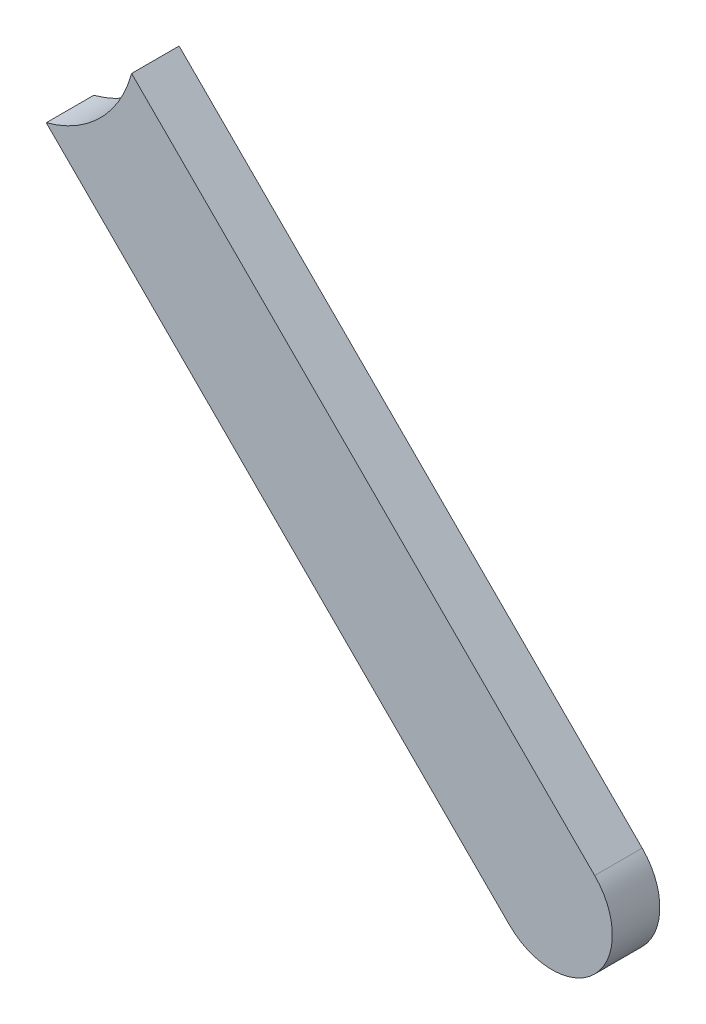
ISO-10303-21;
HEADER;
FILE_DESCRIPTION(('STEP AP214'),'2;1');
FILE_NAME('part.step','',(''),(''),'','','');
FILE_SCHEMA(('AUTOMOTIVE_DESIGN { 1 0 10303 214 1 1 1 1 }'));
ENDSEC;
DATA;
#1=APPLICATION_CONTEXT('core data for automotive mechanical design processes');
#2=APPLICATION_PROTOCOL_DEFINITION('international standard','automotive_design',2000,#1);
#3=PRODUCT_CONTEXT('',#1,'mechanical');
#4=PRODUCT('Part','Part','',(#3));
#5=PRODUCT_RELATED_PRODUCT_CATEGORY('part','',(#4));
#6=PRODUCT_DEFINITION_FORMATION('','',#4);
#7=PRODUCT_DEFINITION_CONTEXT('part definition',#1,'design');
#8=PRODUCT_DEFINITION('design','',#6,#7);
#9=PRODUCT_DEFINITION_SHAPE('','',#8);
#10=(LENGTH_UNIT() NAMED_UNIT(*) SI_UNIT(.MILLI.,.METRE.));
#11=(NAMED_UNIT(*) PLANE_ANGLE_UNIT() SI_UNIT($,.RADIAN.));
#12=(NAMED_UNIT(*) SI_UNIT($,.STERADIAN.) SOLID_ANGLE_UNIT());
#13=UNCERTAINTY_MEASURE_WITH_UNIT(LENGTH_MEASURE(1.E-05),#10,'distance_accuracy_value','');
#14=(GEOMETRIC_REPRESENTATION_CONTEXT(3) GLOBAL_UNCERTAINTY_ASSIGNED_CONTEXT((#13)) GLOBAL_UNIT_ASSIGNED_CONTEXT((#10,
#11,#12)) REPRESENTATION_CONTEXT('',''));
#15=CARTESIAN_POINT('',(0.,0.,0.));
#16=DIRECTION('',(0.,0.,1.));
#17=DIRECTION('',(1.,0.,0.));
#18=AXIS2_PLACEMENT_3D('',#15,#16,#17);
#19=CARTESIAN_POINT('',(90.3014787853028,80.0273093346972,0.));
#20=DIRECTION('',(0.707106781186548,0.707106781186548,0.));
#21=DIRECTION('',(0.707106781186548,-0.707106781186548,0.));
#22=AXIS2_PLACEMENT_3D('',#19,#20,#21);
#23=PLANE('',#22);
#24=DIRECTION('',(0.707106781186548,-0.707106781186548,0.));
#25=VECTOR('',#24,1.);
#26=CARTESIAN_POINT('',(89.99039406,80.33839406,0.1999996));
#27=LINE('',#26,#25);
#28=CARTESIAN_POINT('',(90.3014787853028,80.0273093346972,0.1999996));
#29=VERTEX_POINT('',#28);
#30=CARTESIAN_POINT('',(92.25099406,78.07779406,0.1999996));
#31=VERTEX_POINT('',#30);
#32=EDGE_CURVE('E11',#29,#31,#27,.T.);
#33=ORIENTED_EDGE('',*,*,#32,.F.);
#34=DIRECTION('',(0.,0.,1.));
#35=VECTOR('',#34,1.);
#36=CARTESIAN_POINT('',(90.3014787853028,80.0273093346972,0.));
#37=LINE('',#36,#35);
#38=CARTESIAN_POINT('',(90.3014787853028,80.0273093346972,0.));
#39=VERTEX_POINT('',#38);
#40=EDGE_CURVE('E24',#39,#29,#37,.T.);
#41=ORIENTED_EDGE('',*,*,#40,.F.);
#42=DIRECTION('',(0.707106781186548,-0.707106781186548,0.));
#43=VECTOR('',#42,1.);
#44=CARTESIAN_POINT('',(89.99039406,80.33839406,0.));
#45=LINE('',#44,#43);
#46=CARTESIAN_POINT('',(92.25099406,78.07779406,0.));
#47=VERTEX_POINT('',#46);
#48=EDGE_CURVE('E75',#39,#47,#45,.T.);
#49=ORIENTED_EDGE('',*,*,#48,.T.);
#50=DIRECTION('',(0.,0.,1.));
#51=VECTOR('',#50,1.);
#52=CARTESIAN_POINT('',(92.25099406,78.07779406,0.));
#53=LINE('',#52,#51);
#54=EDGE_CURVE('E37',#47,#31,#53,.T.);
#55=ORIENTED_EDGE('',*,*,#54,.T.);
#56=EDGE_LOOP('',(#33,#41,#49,#55));
#57=FACE_BOUND('',#56,.T.);
#58=ADVANCED_FACE('F17',(#57),#23,.F.);
#59=CARTESIAN_POINT('',(92.4306,78.2574,0.));
#60=DIRECTION('',(0.,0.,-1.));
#61=DIRECTION('',(-0.707106781186576,-0.70710678118652,0.));
#62=AXIS2_PLACEMENT_3D('',#59,#60,#61);
#63=CYLINDRICAL_SURFACE('',#62,0.254001156230758);
#64=CARTESIAN_POINT('',(92.4306,78.2574,0.1999996));
#65=DIRECTION('',(0.,0.,1.));
#66=DIRECTION('',(-0.707106781186576,-0.70710678118652,0.));
#67=AXIS2_PLACEMENT_3D('',#64,#65,#66);
#68=CIRCLE('',#67,0.254001156230758);
#69=CARTESIAN_POINT('',(92.61020594,78.43700594,0.1999996));
#70=VERTEX_POINT('',#69);
#71=EDGE_CURVE('E83',#31,#70,#68,.T.);
#72=ORIENTED_EDGE('',*,*,#71,.F.);
#73=ORIENTED_EDGE('',*,*,#54,.F.);
#74=CARTESIAN_POINT('',(92.4306,78.2574,0.));
#75=DIRECTION('',(0.,0.,1.));
#76=DIRECTION('',(-0.707106781186576,-0.70710678118652,0.));
#77=AXIS2_PLACEMENT_3D('',#74,#75,#76);
#78=CIRCLE('',#77,0.254001156230758);
#79=CARTESIAN_POINT('',(92.61020594,78.43700594,0.));
#80=VERTEX_POINT('',#79);
#81=EDGE_CURVE('E81',#47,#80,#78,.T.);
#82=ORIENTED_EDGE('',*,*,#81,.T.);
#83=DIRECTION('',(0.,0.,1.));
#84=VECTOR('',#83,1.);
#85=CARTESIAN_POINT('',(92.61020594,78.43700594,0.));
#86=LINE('',#85,#84);
#87=EDGE_CURVE('E67',#80,#70,#86,.T.);
#88=ORIENTED_EDGE('',*,*,#87,.T.);
#89=EDGE_LOOP('',(#72,#73,#82,#88));
#90=FACE_BOUND('',#89,.T.);
#91=ADVANCED_FACE('F89',(#90),#63,.T.);
#92=CARTESIAN_POINT('',(92.61020594,78.43700594,0.));
#93=DIRECTION('',(-0.707106781186548,-0.707106781186548,0.));
#94=DIRECTION('',(-0.707106781186548,0.707106781186548,0.));
#95=AXIS2_PLACEMENT_3D('',#92,#93,#94);
#96=PLANE('',#95);
#97=DIRECTION('',(-0.707106781186548,0.707106781186548,0.));
#98=VECTOR('',#97,1.);
#99=CARTESIAN_POINT('',(92.61020594,78.43700594,0.1999996));
#100=LINE('',#99,#98);
#101=CARTESIAN_POINT('',(90.6606906653028,80.3865212146972,0.1999996));
#102=VERTEX_POINT('',#101);
#103=EDGE_CURVE('E71',#70,#102,#100,.T.);
#104=ORIENTED_EDGE('',*,*,#103,.F.);
#105=ORIENTED_EDGE('',*,*,#87,.F.);
#106=DIRECTION('',(-0.707106781186548,0.707106781186548,0.));
#107=VECTOR('',#106,1.);
#108=CARTESIAN_POINT('',(92.61020594,78.43700594,0.));
#109=LINE('',#108,#107);
#110=CARTESIAN_POINT('',(90.6606906653028,80.3865212146972,0.));
#111=VERTEX_POINT('',#110);
#112=EDGE_CURVE('E63',#80,#111,#109,.T.);
#113=ORIENTED_EDGE('',*,*,#112,.T.);
#114=DIRECTION('',(0.,0.,1.));
#115=VECTOR('',#114,1.);
#116=CARTESIAN_POINT('',(90.6606906653028,80.3865212146972,0.));
#117=LINE('',#116,#115);
#118=EDGE_CURVE('E53',#111,#102,#117,.T.);
#119=ORIENTED_EDGE('',*,*,#118,.T.);
#120=EDGE_LOOP('',(#104,#105,#113,#119));
#121=FACE_BOUND('',#120,.T.);
#122=ADVANCED_FACE('F66',(#121),#96,.F.);
#123=CARTESIAN_POINT('',(90.17,80.518,0.));
#124=DIRECTION('',(0.,0.,-1.));
#125=DIRECTION('',(1.,0.,0.));
#126=AXIS2_PLACEMENT_3D('',#123,#124,#125);
#127=CYLINDRICAL_SURFACE('',#126,0.508);
#128=ORIENTED_EDGE('',*,*,#40,.T.);
#129=CARTESIAN_POINT('',(90.17,80.518,0.1999996));
#130=DIRECTION('',(0.,0.,1.));
#131=DIRECTION('',(1.,0.,0.));
#132=AXIS2_PLACEMENT_3D('',#129,#130,#131);
#133=CIRCLE('',#132,0.508);
#134=EDGE_CURVE('E59',#29,#102,#133,.T.);
#135=ORIENTED_EDGE('',*,*,#134,.T.);
#136=ORIENTED_EDGE('',*,*,#118,.F.);
#137=CARTESIAN_POINT('',(90.17,80.518,0.));
#138=DIRECTION('',(0.,0.,1.));
#139=DIRECTION('',(1.,0.,0.));
#140=AXIS2_PLACEMENT_3D('',#137,#138,#139);
#141=CIRCLE('',#140,0.508);
#142=EDGE_CURVE('E57',#39,#111,#141,.T.);
#143=ORIENTED_EDGE('',*,*,#142,.F.);
#144=EDGE_LOOP('',(#128,#135,#136,#143));
#145=FACE_BOUND('',#144,.T.);
#146=ADVANCED_FACE('F55',(#145),#127,.F.);
#147=CARTESIAN_POINT('',(89.99039406,80.33839406,0.));
#148=DIRECTION('',(0.,0.,-1.));
#149=DIRECTION('',(-1.,0.,0.));
#150=AXIS2_PLACEMENT_3D('',#147,#148,#149);
#151=PLANE('',#150);
#152=ORIENTED_EDGE('',*,*,#48,.F.);
#153=ORIENTED_EDGE('',*,*,#142,.T.);
#154=ORIENTED_EDGE('',*,*,#112,.F.);
#155=ORIENTED_EDGE('',*,*,#81,.F.);
#156=EDGE_LOOP('',(#152,#153,#154,#155));
#157=FACE_BOUND('',#156,.T.);
#158=ADVANCED_FACE('F74',(#157),#151,.T.);
#159=CARTESIAN_POINT('',(89.99039406,80.33839406,0.1999996));
#160=DIRECTION('',(0.,0.,-1.));
#161=DIRECTION('',(-1.,0.,0.));
#162=AXIS2_PLACEMENT_3D('',#159,#160,#161);
#163=PLANE('',#162);
#164=ORIENTED_EDGE('',*,*,#134,.F.);
#165=ORIENTED_EDGE('',*,*,#32,.T.);
#166=ORIENTED_EDGE('',*,*,#71,.T.);
#167=ORIENTED_EDGE('',*,*,#103,.T.);
#168=EDGE_LOOP('',(#164,#165,#166,#167));
#169=FACE_BOUND('',#168,.T.);
#170=ADVANCED_FACE('F91',(#169),#163,.F.);
#171=CLOSED_SHELL('',(#58,#91,#122,#146,#158,#170));
#172=MANIFOLD_SOLID_BREP('B1',#171);
#173=ADVANCED_BREP_SHAPE_REPRESENTATION('',(#18,#172),#14);
#174=SHAPE_DEFINITION_REPRESENTATION(#9,#173);
ENDSEC;
END-ISO-10303-21;
